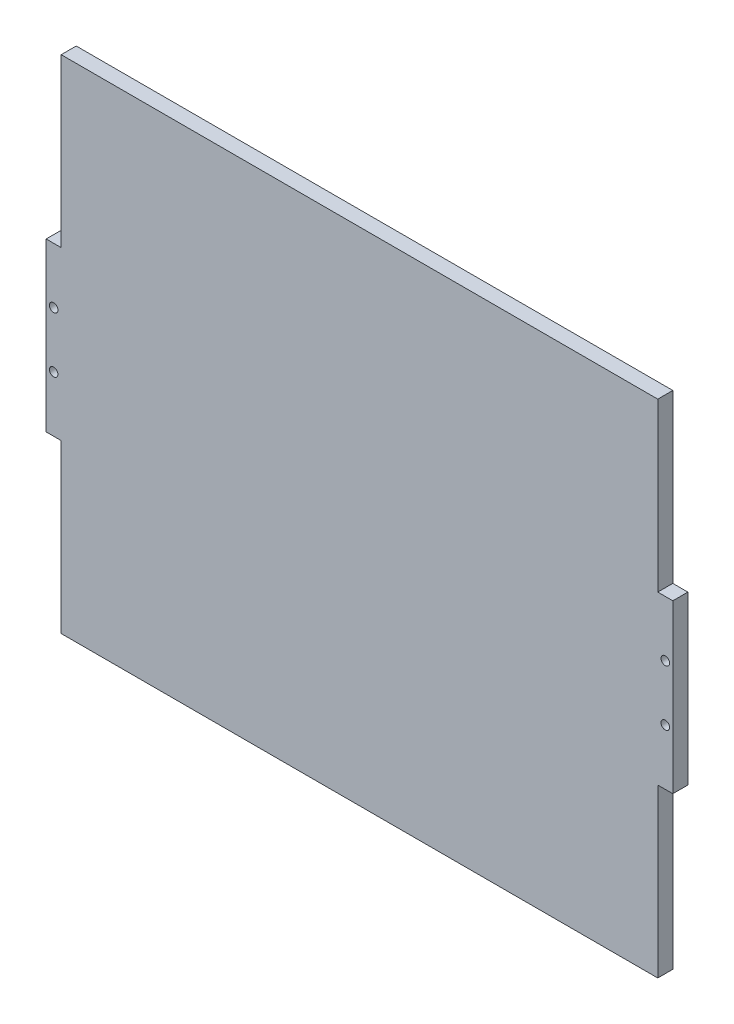
ISO-10303-21;
HEADER;
FILE_DESCRIPTION(('STEP AP214'),'2;1');
FILE_NAME('part.step','',(''),(''),'','','');
FILE_SCHEMA(('AUTOMOTIVE_DESIGN { 1 0 10303 214 1 1 1 1 }'));
ENDSEC;
DATA;
#1=APPLICATION_CONTEXT('core data for automotive mechanical design processes');
#2=APPLICATION_PROTOCOL_DEFINITION('international standard','automotive_design',2000,#1);
#3=PRODUCT_CONTEXT('',#1,'mechanical');
#4=PRODUCT('Part','Part','',(#3));
#5=PRODUCT_RELATED_PRODUCT_CATEGORY('part','',(#4));
#6=PRODUCT_DEFINITION_FORMATION('','',#4);
#7=PRODUCT_DEFINITION_CONTEXT('part definition',#1,'design');
#8=PRODUCT_DEFINITION('design','',#6,#7);
#9=PRODUCT_DEFINITION_SHAPE('','',#8);
#10=(LENGTH_UNIT() NAMED_UNIT(*) SI_UNIT(.MILLI.,.METRE.));
#11=(NAMED_UNIT(*) PLANE_ANGLE_UNIT() SI_UNIT($,.RADIAN.));
#12=(NAMED_UNIT(*) SI_UNIT($,.STERADIAN.) SOLID_ANGLE_UNIT());
#13=UNCERTAINTY_MEASURE_WITH_UNIT(LENGTH_MEASURE(1.E-05),#10,'distance_accuracy_value','');
#14=(GEOMETRIC_REPRESENTATION_CONTEXT(3) GLOBAL_UNCERTAINTY_ASSIGNED_CONTEXT((#13)) GLOBAL_UNIT_ASSIGNED_CONTEXT((#10,
#11,#12)) REPRESENTATION_CONTEXT('',''));
#15=CARTESIAN_POINT('',(0.,0.,0.));
#16=DIRECTION('',(0.,0.,1.));
#17=DIRECTION('',(1.,0.,0.));
#18=AXIS2_PLACEMENT_3D('',#15,#16,#17);
#19=CARTESIAN_POINT('',(125.,100.,9.));
#20=DIRECTION('',(1.,0.,0.));
#21=DIRECTION('',(0.,1.,0.));
#22=AXIS2_PLACEMENT_3D('',#19,#20,#21);
#23=PLANE('',#22);
#24=DIRECTION('',(0.,-1.,0.));
#25=VECTOR('',#24,1.);
#26=CARTESIAN_POINT('',(125.,100.,9.));
#27=LINE('',#26,#25);
#28=CARTESIAN_POINT('',(125.,233.333333333333,9.));
#29=VERTEX_POINT('',#28);
#30=CARTESIAN_POINT('',(125.,166.666666666667,9.));
#31=VERTEX_POINT('',#30);
#32=EDGE_CURVE('E140',#29,#31,#27,.T.);
#33=ORIENTED_EDGE('',*,*,#32,.F.);
#34=DIRECTION('',(0.,0.,1.));
#35=VECTOR('',#34,1.);
#36=CARTESIAN_POINT('',(125.,233.333333333333,3.));
#37=LINE('',#36,#35);
#38=CARTESIAN_POINT('',(125.,233.333333333333,3.));
#39=VERTEX_POINT('',#38);
#40=EDGE_CURVE('E127',#39,#29,#37,.T.);
#41=ORIENTED_EDGE('',*,*,#40,.F.);
#42=DIRECTION('',(0.,-1.,0.));
#43=VECTOR('',#42,1.);
#44=CARTESIAN_POINT('',(125.,100.,3.));
#45=LINE('',#44,#43);
#46=CARTESIAN_POINT('',(125.,166.666666666667,3.));
#47=VERTEX_POINT('',#46);
#48=EDGE_CURVE('E138',#39,#47,#45,.T.);
#49=ORIENTED_EDGE('',*,*,#48,.T.);
#50=DIRECTION('',(0.,0.,1.));
#51=VECTOR('',#50,1.);
#52=CARTESIAN_POINT('',(125.,166.666666666667,3.));
#53=LINE('',#52,#51);
#54=EDGE_CURVE('E385',#47,#31,#53,.T.);
#55=ORIENTED_EDGE('',*,*,#54,.T.);
#56=EDGE_LOOP('',(#33,#41,#49,#55));
#57=FACE_BOUND('',#56,.T.);
#58=ADVANCED_FACE('F34',(#57),#23,.F.);
#59=CARTESIAN_POINT('',(125.,100.,9.));
#60=DIRECTION('',(0.,1.,0.));
#61=DIRECTION('',(0.,0.,1.));
#62=AXIS2_PLACEMENT_3D('',#59,#60,#61);
#63=PLANE('',#62);
#64=DIRECTION('',(1.,0.,0.));
#65=VECTOR('',#64,1.);
#66=CARTESIAN_POINT('',(125.,100.,9.));
#67=LINE('',#66,#65);
#68=CARTESIAN_POINT('',(131.,100.,9.));
#69=VERTEX_POINT('',#68);
#70=CARTESIAN_POINT('',(369.,100.,9.));
#71=VERTEX_POINT('',#70);
#72=EDGE_CURVE('E163',#69,#71,#67,.T.);
#73=ORIENTED_EDGE('',*,*,#72,.F.);
#74=DIRECTION('',(0.,0.,1.));
#75=VECTOR('',#74,1.);
#76=CARTESIAN_POINT('',(131.,100.,3.));
#77=LINE('',#76,#75);
#78=CARTESIAN_POINT('',(131.,100.,3.));
#79=VERTEX_POINT('',#78);
#80=EDGE_CURVE('E394',#79,#69,#77,.T.);
#81=ORIENTED_EDGE('',*,*,#80,.F.);
#82=DIRECTION('',(1.,0.,0.));
#83=VECTOR('',#82,1.);
#84=CARTESIAN_POINT('',(125.,100.,3.));
#85=LINE('',#84,#83);
#86=CARTESIAN_POINT('',(369.,100.,3.));
#87=VERTEX_POINT('',#86);
#88=EDGE_CURVE('E144',#79,#87,#85,.T.);
#89=ORIENTED_EDGE('',*,*,#88,.T.);
#90=DIRECTION('',(0.,0.,1.));
#91=VECTOR('',#90,1.);
#92=CARTESIAN_POINT('',(369.,100.,3.));
#93=LINE('',#92,#91);
#94=EDGE_CURVE('E398',#87,#71,#93,.T.);
#95=ORIENTED_EDGE('',*,*,#94,.T.);
#96=EDGE_LOOP('',(#73,#81,#89,#95));
#97=FACE_BOUND('',#96,.T.);
#98=ADVANCED_FACE('F193',(#97),#63,.F.);
#99=CARTESIAN_POINT('',(375.,100.,9.));
#100=DIRECTION('',(-1.,0.,0.));
#101=DIRECTION('',(0.,-1.,0.));
#102=AXIS2_PLACEMENT_3D('',#99,#100,#101);
#103=PLANE('',#102);
#104=DIRECTION('',(0.,1.,0.));
#105=VECTOR('',#104,1.);
#106=CARTESIAN_POINT('',(375.,100.,9.));
#107=LINE('',#106,#105);
#108=CARTESIAN_POINT('',(375.,166.666666666667,9.));
#109=VERTEX_POINT('',#108);
#110=CARTESIAN_POINT('',(375.,233.333333333333,9.));
#111=VERTEX_POINT('',#110);
#112=EDGE_CURVE('E42',#109,#111,#107,.T.);
#113=ORIENTED_EDGE('',*,*,#112,.F.);
#114=DIRECTION('',(0.,0.,1.));
#115=VECTOR('',#114,1.);
#116=CARTESIAN_POINT('',(375.,166.666666666667,3.));
#117=LINE('',#116,#115);
#118=CARTESIAN_POINT('',(375.,166.666666666667,3.));
#119=VERTEX_POINT('',#118);
#120=EDGE_CURVE('E411',#119,#109,#117,.T.);
#121=ORIENTED_EDGE('',*,*,#120,.F.);
#122=DIRECTION('',(0.,1.,0.));
#123=VECTOR('',#122,1.);
#124=CARTESIAN_POINT('',(375.,100.,3.));
#125=LINE('',#124,#123);
#126=CARTESIAN_POINT('',(375.,233.333333333333,3.));
#127=VERTEX_POINT('',#126);
#128=EDGE_CURVE('E148',#119,#127,#125,.T.);
#129=ORIENTED_EDGE('',*,*,#128,.T.);
#130=DIRECTION('',(0.,0.,1.));
#131=VECTOR('',#130,1.);
#132=CARTESIAN_POINT('',(375.,233.333333333333,3.));
#133=LINE('',#132,#131);
#134=EDGE_CURVE('E145',#127,#111,#133,.T.);
#135=ORIENTED_EDGE('',*,*,#134,.T.);
#136=EDGE_LOOP('',(#113,#121,#129,#135));
#137=FACE_BOUND('',#136,.T.);
#138=ADVANCED_FACE('F190',(#137),#103,.F.);
#139=CARTESIAN_POINT('',(125.,300.,9.));
#140=DIRECTION('',(0.,-1.,0.));
#141=DIRECTION('',(0.,0.,-1.));
#142=AXIS2_PLACEMENT_3D('',#139,#140,#141);
#143=PLANE('',#142);
#144=DIRECTION('',(-1.,0.,0.));
#145=VECTOR('',#144,1.);
#146=CARTESIAN_POINT('',(125.,300.,3.));
#147=LINE('',#146,#145);
#148=CARTESIAN_POINT('',(369.,300.,3.));
#149=VERTEX_POINT('',#148);
#150=CARTESIAN_POINT('',(131.,300.,3.));
#151=VERTEX_POINT('',#150);
#152=EDGE_CURVE('E37',#149,#151,#147,.T.);
#153=ORIENTED_EDGE('',*,*,#152,.T.);
#154=DIRECTION('',(0.,0.,1.));
#155=VECTOR('',#154,1.);
#156=CARTESIAN_POINT('',(131.,300.,3.));
#157=LINE('',#156,#155);
#158=CARTESIAN_POINT('',(131.,300.,9.));
#159=VERTEX_POINT('',#158);
#160=EDGE_CURVE('E387',#151,#159,#157,.T.);
#161=ORIENTED_EDGE('',*,*,#160,.T.);
#162=DIRECTION('',(-1.,0.,0.));
#163=VECTOR('',#162,1.);
#164=CARTESIAN_POINT('',(125.,300.,9.));
#165=LINE('',#164,#163);
#166=CARTESIAN_POINT('',(369.,300.,9.));
#167=VERTEX_POINT('',#166);
#168=EDGE_CURVE('E11',#167,#159,#165,.T.);
#169=ORIENTED_EDGE('',*,*,#168,.F.);
#170=DIRECTION('',(0.,0.,1.));
#171=VECTOR('',#170,1.);
#172=CARTESIAN_POINT('',(369.,300.,3.));
#173=LINE('',#172,#171);
#174=EDGE_CURVE('E170',#149,#167,#173,.T.);
#175=ORIENTED_EDGE('',*,*,#174,.F.);
#176=EDGE_LOOP('',(#153,#161,#169,#175));
#177=FACE_BOUND('',#176,.T.);
#178=ADVANCED_FACE('F192',(#177),#143,.F.);
#179=CARTESIAN_POINT('',(125.,100.,9.));
#180=DIRECTION('',(0.,0.,-1.));
#181=DIRECTION('',(-1.,0.,0.));
#182=AXIS2_PLACEMENT_3D('',#179,#180,#181);
#183=PLANE('',#182);
#184=CARTESIAN_POINT('',(372.,211.113333333333,9.));
#185=DIRECTION('',(0.,0.,-1.));
#186=DIRECTION('',(-1.,0.,0.));
#187=AXIS2_PLACEMENT_3D('',#184,#185,#186);
#188=CIRCLE('',#187,1.69999999999998);
#189=CARTESIAN_POINT('',(370.3,211.113333333333,9.));
#190=VERTEX_POINT('',#189);
#191=EDGE_CURVE('E357',#190,#190,#188,.T.);
#192=ORIENTED_EDGE('',*,*,#191,.T.);
#193=EDGE_LOOP('',(#192));
#194=FACE_BOUND('',#193,.T.);
#195=CARTESIAN_POINT('',(372.,188.886666666667,9.));
#196=DIRECTION('',(0.,0.,-1.));
#197=DIRECTION('',(-1.,0.,0.));
#198=AXIS2_PLACEMENT_3D('',#195,#196,#197);
#199=CIRCLE('',#198,1.69999999999998);
#200=CARTESIAN_POINT('',(370.3,188.886666666667,9.));
#201=VERTEX_POINT('',#200);
#202=EDGE_CURVE('E367',#201,#201,#199,.T.);
#203=ORIENTED_EDGE('',*,*,#202,.T.);
#204=EDGE_LOOP('',(#203));
#205=FACE_BOUND('',#204,.T.);
#206=CARTESIAN_POINT('',(128.,211.11,9.));
#207=DIRECTION('',(0.,0.,-1.));
#208=DIRECTION('',(-1.,0.,0.));
#209=AXIS2_PLACEMENT_3D('',#206,#207,#208);
#210=CIRCLE('',#209,1.69999999999999);
#211=CARTESIAN_POINT('',(126.3,211.11,9.));
#212=VERTEX_POINT('',#211);
#213=EDGE_CURVE('E373',#212,#212,#210,.T.);
#214=ORIENTED_EDGE('',*,*,#213,.T.);
#215=EDGE_LOOP('',(#214));
#216=FACE_BOUND('',#215,.T.);
#217=CARTESIAN_POINT('',(128.,188.89,9.));
#218=DIRECTION('',(0.,0.,-1.));
#219=DIRECTION('',(-1.,0.,0.));
#220=AXIS2_PLACEMENT_3D('',#217,#218,#219);
#221=CIRCLE('',#220,1.69999999999999);
#222=CARTESIAN_POINT('',(126.3,188.89,9.));
#223=VERTEX_POINT('',#222);
#224=EDGE_CURVE('E379',#223,#223,#221,.T.);
#225=ORIENTED_EDGE('',*,*,#224,.T.);
#226=EDGE_LOOP('',(#225));
#227=FACE_BOUND('',#226,.T.);
#228=ORIENTED_EDGE('',*,*,#168,.T.);
#229=DIRECTION('',(0.,1.,0.));
#230=VECTOR('',#229,1.);
#231=CARTESIAN_POINT('',(131.,300.,9.));
#232=LINE('',#231,#230);
#233=CARTESIAN_POINT('',(131.,233.333333333333,9.));
#234=VERTEX_POINT('',#233);
#235=EDGE_CURVE('E132',#234,#159,#232,.T.);
#236=ORIENTED_EDGE('',*,*,#235,.F.);
#237=DIRECTION('',(1.,0.,0.));
#238=VECTOR('',#237,1.);
#239=CARTESIAN_POINT('',(125.,233.333333333333,9.));
#240=LINE('',#239,#238);
#241=EDGE_CURVE('E383',#29,#234,#240,.T.);
#242=ORIENTED_EDGE('',*,*,#241,.F.);
#243=ORIENTED_EDGE('',*,*,#32,.T.);
#244=DIRECTION('',(-1.,0.,0.));
#245=VECTOR('',#244,1.);
#246=CARTESIAN_POINT('',(125.,166.666666666667,9.));
#247=LINE('',#246,#245);
#248=CARTESIAN_POINT('',(131.,166.666666666667,9.));
#249=VERTEX_POINT('',#248);
#250=EDGE_CURVE('E392',#249,#31,#247,.T.);
#251=ORIENTED_EDGE('',*,*,#250,.F.);
#252=DIRECTION('',(0.,1.,0.));
#253=VECTOR('',#252,1.);
#254=CARTESIAN_POINT('',(131.,100.,9.));
#255=LINE('',#254,#253);
#256=EDGE_CURVE('E395',#69,#249,#255,.T.);
#257=ORIENTED_EDGE('',*,*,#256,.F.);
#258=ORIENTED_EDGE('',*,*,#72,.T.);
#259=DIRECTION('',(0.,-1.,0.));
#260=VECTOR('',#259,1.);
#261=CARTESIAN_POINT('',(369.,100.,9.));
#262=LINE('',#261,#260);
#263=CARTESIAN_POINT('',(369.,166.666666666667,9.));
#264=VERTEX_POINT('',#263);
#265=EDGE_CURVE('E408',#264,#71,#262,.T.);
#266=ORIENTED_EDGE('',*,*,#265,.F.);
#267=DIRECTION('',(-1.,0.,0.));
#268=VECTOR('',#267,1.);
#269=CARTESIAN_POINT('',(375.,166.666666666667,9.));
#270=LINE('',#269,#268);
#271=EDGE_CURVE('E181',#109,#264,#270,.T.);
#272=ORIENTED_EDGE('',*,*,#271,.F.);
#273=ORIENTED_EDGE('',*,*,#112,.T.);
#274=DIRECTION('',(1.,0.,0.));
#275=VECTOR('',#274,1.);
#276=CARTESIAN_POINT('',(375.,233.333333333333,9.));
#277=LINE('',#276,#275);
#278=CARTESIAN_POINT('',(369.,233.333333333333,9.));
#279=VERTEX_POINT('',#278);
#280=EDGE_CURVE('E178',#279,#111,#277,.T.);
#281=ORIENTED_EDGE('',*,*,#280,.F.);
#282=DIRECTION('',(0.,-1.,0.));
#283=VECTOR('',#282,1.);
#284=CARTESIAN_POINT('',(369.,300.,9.));
#285=LINE('',#284,#283);
#286=EDGE_CURVE('E188',#167,#279,#285,.T.);
#287=ORIENTED_EDGE('',*,*,#286,.F.);
#288=EDGE_LOOP('',(#228,#236,#242,#243,#251,#257,#258,#266,#272,#273,#281,#287));
#289=FACE_BOUND('',#288,.T.);
#290=ADVANCED_FACE('F176',(#194,#205,#216,#227,#289),#183,.F.);
#291=CARTESIAN_POINT('',(125.,100.,3.));
#292=DIRECTION('',(0.,0.,-1.));
#293=DIRECTION('',(-1.,0.,0.));
#294=AXIS2_PLACEMENT_3D('',#291,#292,#293);
#295=PLANE('',#294);
#296=CARTESIAN_POINT('',(372.,211.113333333333,3.));
#297=DIRECTION('',(0.,0.,-1.));
#298=DIRECTION('',(-1.,0.,0.));
#299=AXIS2_PLACEMENT_3D('',#296,#297,#298);
#300=CIRCLE('',#299,1.69999999999998);
#301=CARTESIAN_POINT('',(370.3,211.113333333333,3.));
#302=VERTEX_POINT('',#301);
#303=EDGE_CURVE('E360',#302,#302,#300,.T.);
#304=ORIENTED_EDGE('',*,*,#303,.F.);
#305=EDGE_LOOP('',(#304));
#306=FACE_BOUND('',#305,.T.);
#307=CARTESIAN_POINT('',(372.,188.886666666667,3.));
#308=DIRECTION('',(0.,0.,-1.));
#309=DIRECTION('',(-1.,0.,0.));
#310=AXIS2_PLACEMENT_3D('',#307,#308,#309);
#311=CIRCLE('',#310,1.69999999999998);
#312=CARTESIAN_POINT('',(370.3,188.886666666667,3.));
#313=VERTEX_POINT('',#312);
#314=EDGE_CURVE('E362',#313,#313,#311,.T.);
#315=ORIENTED_EDGE('',*,*,#314,.F.);
#316=EDGE_LOOP('',(#315));
#317=FACE_BOUND('',#316,.T.);
#318=CARTESIAN_POINT('',(128.,211.11,3.));
#319=DIRECTION('',(0.,0.,-1.));
#320=DIRECTION('',(-1.,0.,0.));
#321=AXIS2_PLACEMENT_3D('',#318,#319,#320);
#322=CIRCLE('',#321,1.69999999999998);
#323=CARTESIAN_POINT('',(126.3,211.11,3.));
#324=VERTEX_POINT('',#323);
#325=EDGE_CURVE('E370',#324,#324,#322,.T.);
#326=ORIENTED_EDGE('',*,*,#325,.F.);
#327=EDGE_LOOP('',(#326));
#328=FACE_BOUND('',#327,.T.);
#329=CARTESIAN_POINT('',(128.,188.89,3.));
#330=DIRECTION('',(0.,0.,-1.));
#331=DIRECTION('',(-1.,0.,0.));
#332=AXIS2_PLACEMENT_3D('',#329,#330,#331);
#333=CIRCLE('',#332,1.69999999999998);
#334=CARTESIAN_POINT('',(126.3,188.89,3.));
#335=VERTEX_POINT('',#334);
#336=EDGE_CURVE('E376',#335,#335,#333,.T.);
#337=ORIENTED_EDGE('',*,*,#336,.F.);
#338=EDGE_LOOP('',(#337));
#339=FACE_BOUND('',#338,.T.);
#340=DIRECTION('',(0.,1.,0.));
#341=VECTOR('',#340,1.);
#342=CARTESIAN_POINT('',(131.,300.,3.));
#343=LINE('',#342,#341);
#344=CARTESIAN_POINT('',(131.,233.333333333333,3.));
#345=VERTEX_POINT('',#344);
#346=EDGE_CURVE('E50',#345,#151,#343,.T.);
#347=ORIENTED_EDGE('',*,*,#346,.T.);
#348=ORIENTED_EDGE('',*,*,#152,.F.);
#349=DIRECTION('',(0.,-1.,0.));
#350=VECTOR('',#349,1.);
#351=CARTESIAN_POINT('',(369.,300.,3.));
#352=LINE('',#351,#350);
#353=CARTESIAN_POINT('',(369.,233.333333333333,3.));
#354=VERTEX_POINT('',#353);
#355=EDGE_CURVE('E187',#149,#354,#352,.T.);
#356=ORIENTED_EDGE('',*,*,#355,.T.);
#357=DIRECTION('',(1.,0.,0.));
#358=VECTOR('',#357,1.);
#359=CARTESIAN_POINT('',(375.,233.333333333333,3.));
#360=LINE('',#359,#358);
#361=EDGE_CURVE('E421',#354,#127,#360,.T.);
#362=ORIENTED_EDGE('',*,*,#361,.T.);
#363=ORIENTED_EDGE('',*,*,#128,.F.);
#364=DIRECTION('',(-1.,0.,0.));
#365=VECTOR('',#364,1.);
#366=CARTESIAN_POINT('',(375.,166.666666666667,3.));
#367=LINE('',#366,#365);
#368=CARTESIAN_POINT('',(369.,166.666666666667,3.));
#369=VERTEX_POINT('',#368);
#370=EDGE_CURVE('E404',#119,#369,#367,.T.);
#371=ORIENTED_EDGE('',*,*,#370,.T.);
#372=DIRECTION('',(0.,-1.,0.));
#373=VECTOR('',#372,1.);
#374=CARTESIAN_POINT('',(369.,100.,3.));
#375=LINE('',#374,#373);
#376=EDGE_CURVE('E407',#369,#87,#375,.T.);
#377=ORIENTED_EDGE('',*,*,#376,.T.);
#378=ORIENTED_EDGE('',*,*,#88,.F.);
#379=DIRECTION('',(0.,1.,0.));
#380=VECTOR('',#379,1.);
#381=CARTESIAN_POINT('',(131.,100.,3.));
#382=LINE('',#381,#380);
#383=CARTESIAN_POINT('',(131.,166.666666666667,3.));
#384=VERTEX_POINT('',#383);
#385=EDGE_CURVE('E390',#79,#384,#382,.T.);
#386=ORIENTED_EDGE('',*,*,#385,.T.);
#387=DIRECTION('',(-1.,0.,0.));
#388=VECTOR('',#387,1.);
#389=CARTESIAN_POINT('',(125.,166.666666666667,3.));
#390=LINE('',#389,#388);
#391=EDGE_CURVE('E58',#384,#47,#390,.T.);
#392=ORIENTED_EDGE('',*,*,#391,.T.);
#393=ORIENTED_EDGE('',*,*,#48,.F.);
#394=DIRECTION('',(1.,0.,0.));
#395=VECTOR('',#394,1.);
#396=CARTESIAN_POINT('',(125.,233.333333333333,3.));
#397=LINE('',#396,#395);
#398=EDGE_CURVE('E123',#39,#345,#397,.T.);
#399=ORIENTED_EDGE('',*,*,#398,.T.);
#400=EDGE_LOOP('',(#347,#348,#356,#362,#363,#371,#377,#378,#386,#392,#393,#399));
#401=FACE_BOUND('',#400,.T.);
#402=ADVANCED_FACE('F142',(#306,#317,#328,#339,#401),#295,.T.);
#403=CARTESIAN_POINT('',(375.,233.333333333333,3.));
#404=DIRECTION('',(0.,-1.,0.));
#405=DIRECTION('',(0.,0.,-1.));
#406=AXIS2_PLACEMENT_3D('',#403,#404,#405);
#407=PLANE('',#406);
#408=ORIENTED_EDGE('',*,*,#280,.T.);
#409=ORIENTED_EDGE('',*,*,#134,.F.);
#410=ORIENTED_EDGE('',*,*,#361,.F.);
#411=DIRECTION('',(0.,0.,1.));
#412=VECTOR('',#411,1.);
#413=CARTESIAN_POINT('',(369.,233.333333333333,3.));
#414=LINE('',#413,#412);
#415=EDGE_CURVE('E151',#354,#279,#414,.T.);
#416=ORIENTED_EDGE('',*,*,#415,.T.);
#417=EDGE_LOOP('',(#408,#409,#410,#416));
#418=FACE_BOUND('',#417,.T.);
#419=ADVANCED_FACE('F183',(#418),#407,.F.);
#420=CARTESIAN_POINT('',(369.,300.,3.));
#421=DIRECTION('',(-1.,0.,0.));
#422=DIRECTION('',(0.,-1.,0.));
#423=AXIS2_PLACEMENT_3D('',#420,#421,#422);
#424=PLANE('',#423);
#425=ORIENTED_EDGE('',*,*,#286,.T.);
#426=ORIENTED_EDGE('',*,*,#415,.F.);
#427=ORIENTED_EDGE('',*,*,#355,.F.);
#428=ORIENTED_EDGE('',*,*,#174,.T.);
#429=EDGE_LOOP('',(#425,#426,#427,#428));
#430=FACE_BOUND('',#429,.T.);
#431=ADVANCED_FACE('F229',(#430),#424,.F.);
#432=CARTESIAN_POINT('',(369.,100.,3.));
#433=DIRECTION('',(-1.,0.,0.));
#434=DIRECTION('',(0.,0.,1.));
#435=AXIS2_PLACEMENT_3D('',#432,#433,#434);
#436=PLANE('',#435);
#437=ORIENTED_EDGE('',*,*,#265,.T.);
#438=ORIENTED_EDGE('',*,*,#94,.F.);
#439=ORIENTED_EDGE('',*,*,#376,.F.);
#440=DIRECTION('',(0.,0.,1.));
#441=VECTOR('',#440,1.);
#442=CARTESIAN_POINT('',(369.,166.666666666667,3.));
#443=LINE('',#442,#441);
#444=EDGE_CURVE('E416',#369,#264,#443,.T.);
#445=ORIENTED_EDGE('',*,*,#444,.T.);
#446=EDGE_LOOP('',(#437,#438,#439,#445));
#447=FACE_BOUND('',#446,.T.);
#448=ADVANCED_FACE('F240',(#447),#436,.F.);
#449=CARTESIAN_POINT('',(375.,166.666666666667,3.));
#450=DIRECTION('',(0.,1.,0.));
#451=DIRECTION('',(0.,0.,1.));
#452=AXIS2_PLACEMENT_3D('',#449,#450,#451);
#453=PLANE('',#452);
#454=ORIENTED_EDGE('',*,*,#271,.T.);
#455=ORIENTED_EDGE('',*,*,#444,.F.);
#456=ORIENTED_EDGE('',*,*,#370,.F.);
#457=ORIENTED_EDGE('',*,*,#120,.T.);
#458=EDGE_LOOP('',(#454,#455,#456,#457));
#459=FACE_BOUND('',#458,.T.);
#460=ADVANCED_FACE('F250',(#459),#453,.F.);
#461=CARTESIAN_POINT('',(125.,166.666666666667,3.));
#462=DIRECTION('',(0.,1.,0.));
#463=DIRECTION('',(0.,0.,1.));
#464=AXIS2_PLACEMENT_3D('',#461,#462,#463);
#465=PLANE('',#464);
#466=ORIENTED_EDGE('',*,*,#250,.T.);
#467=ORIENTED_EDGE('',*,*,#54,.F.);
#468=ORIENTED_EDGE('',*,*,#391,.F.);
#469=DIRECTION('',(0.,0.,1.));
#470=VECTOR('',#469,1.);
#471=CARTESIAN_POINT('',(131.,166.666666666667,3.));
#472=LINE('',#471,#470);
#473=EDGE_CURVE('E401',#384,#249,#472,.T.);
#474=ORIENTED_EDGE('',*,*,#473,.T.);
#475=EDGE_LOOP('',(#466,#467,#468,#474));
#476=FACE_BOUND('',#475,.T.);
#477=ADVANCED_FACE('F260',(#476),#465,.F.);
#478=CARTESIAN_POINT('',(131.,100.,3.));
#479=DIRECTION('',(1.,0.,0.));
#480=DIRECTION('',(0.,0.,-1.));
#481=AXIS2_PLACEMENT_3D('',#478,#479,#480);
#482=PLANE('',#481);
#483=ORIENTED_EDGE('',*,*,#256,.T.);
#484=ORIENTED_EDGE('',*,*,#473,.F.);
#485=ORIENTED_EDGE('',*,*,#385,.F.);
#486=ORIENTED_EDGE('',*,*,#80,.T.);
#487=EDGE_LOOP('',(#483,#484,#485,#486));
#488=FACE_BOUND('',#487,.T.);
#489=ADVANCED_FACE('F270',(#488),#482,.F.);
#490=CARTESIAN_POINT('',(131.,300.,3.));
#491=DIRECTION('',(1.,0.,0.));
#492=DIRECTION('',(0.,1.,0.));
#493=AXIS2_PLACEMENT_3D('',#490,#491,#492);
#494=PLANE('',#493);
#495=ORIENTED_EDGE('',*,*,#235,.T.);
#496=ORIENTED_EDGE('',*,*,#160,.F.);
#497=ORIENTED_EDGE('',*,*,#346,.F.);
#498=DIRECTION('',(0.,0.,1.));
#499=VECTOR('',#498,1.);
#500=CARTESIAN_POINT('',(131.,233.333333333333,3.));
#501=LINE('',#500,#499);
#502=EDGE_CURVE('E129',#345,#234,#501,.T.);
#503=ORIENTED_EDGE('',*,*,#502,.T.);
#504=EDGE_LOOP('',(#495,#496,#497,#503));
#505=FACE_BOUND('',#504,.T.);
#506=ADVANCED_FACE('F279',(#505),#494,.F.);
#507=CARTESIAN_POINT('',(125.,233.333333333333,3.));
#508=DIRECTION('',(0.,-1.,0.));
#509=DIRECTION('',(0.,0.,-1.));
#510=AXIS2_PLACEMENT_3D('',#507,#508,#509);
#511=PLANE('',#510);
#512=ORIENTED_EDGE('',*,*,#241,.T.);
#513=ORIENTED_EDGE('',*,*,#502,.F.);
#514=ORIENTED_EDGE('',*,*,#398,.F.);
#515=ORIENTED_EDGE('',*,*,#40,.T.);
#516=EDGE_LOOP('',(#512,#513,#514,#515));
#517=FACE_BOUND('',#516,.T.);
#518=ADVANCED_FACE('F126',(#517),#511,.F.);
#519=CARTESIAN_POINT('',(128.,188.89,3.));
#520=DIRECTION('',(0.,0.,-1.));
#521=DIRECTION('',(-1.,0.,0.));
#522=AXIS2_PLACEMENT_3D('',#519,#520,#521);
#523=CYLINDRICAL_SURFACE('',#522,1.69999999999999);
#524=ORIENTED_EDGE('',*,*,#224,.F.);
#525=EDGE_LOOP('',(#524));
#526=FACE_BOUND('',#525,.T.);
#527=ORIENTED_EDGE('',*,*,#336,.T.);
#528=EDGE_LOOP('',(#527));
#529=FACE_BOUND('',#528,.T.);
#530=ADVANCED_FACE('F297',(#526,#529),#523,.F.);
#531=CARTESIAN_POINT('',(128.,211.11,3.));
#532=DIRECTION('',(0.,0.,-1.));
#533=DIRECTION('',(-1.,0.,0.));
#534=AXIS2_PLACEMENT_3D('',#531,#532,#533);
#535=CYLINDRICAL_SURFACE('',#534,1.69999999999999);
#536=ORIENTED_EDGE('',*,*,#213,.F.);
#537=EDGE_LOOP('',(#536));
#538=FACE_BOUND('',#537,.T.);
#539=ORIENTED_EDGE('',*,*,#325,.T.);
#540=EDGE_LOOP('',(#539));
#541=FACE_BOUND('',#540,.T.);
#542=ADVANCED_FACE('F320',(#538,#541),#535,.F.);
#543=CARTESIAN_POINT('',(372.,188.886666666667,3.));
#544=DIRECTION('',(0.,0.,-1.));
#545=DIRECTION('',(-1.,0.,0.));
#546=AXIS2_PLACEMENT_3D('',#543,#544,#545);
#547=CYLINDRICAL_SURFACE('',#546,1.69999999999998);
#548=ORIENTED_EDGE('',*,*,#202,.F.);
#549=EDGE_LOOP('',(#548));
#550=FACE_BOUND('',#549,.T.);
#551=ORIENTED_EDGE('',*,*,#314,.T.);
#552=EDGE_LOOP('',(#551));
#553=FACE_BOUND('',#552,.T.);
#554=ADVANCED_FACE('F330',(#550,#553),#547,.F.);
#555=CARTESIAN_POINT('',(372.,211.113333333333,3.));
#556=DIRECTION('',(0.,0.,-1.));
#557=DIRECTION('',(-1.,0.,0.));
#558=AXIS2_PLACEMENT_3D('',#555,#556,#557);
#559=CYLINDRICAL_SURFACE('',#558,1.69999999999998);
#560=ORIENTED_EDGE('',*,*,#191,.F.);
#561=EDGE_LOOP('',(#560));
#562=FACE_BOUND('',#561,.T.);
#563=ORIENTED_EDGE('',*,*,#303,.T.);
#564=EDGE_LOOP('',(#563));
#565=FACE_BOUND('',#564,.T.);
#566=ADVANCED_FACE('F340',(#562,#565),#559,.F.);
#567=CLOSED_SHELL('',(#58,#98,#138,#178,#290,#402,#419,#431,#448,#460,#477,#489,#506,#518,#530,
#542,#554,#566));
#568=MANIFOLD_SOLID_BREP('B2',#567);
#569=ADVANCED_BREP_SHAPE_REPRESENTATION('',(#18,#568),#14);
#570=SHAPE_DEFINITION_REPRESENTATION(#9,#569);
ENDSEC;
END-ISO-10303-21;
